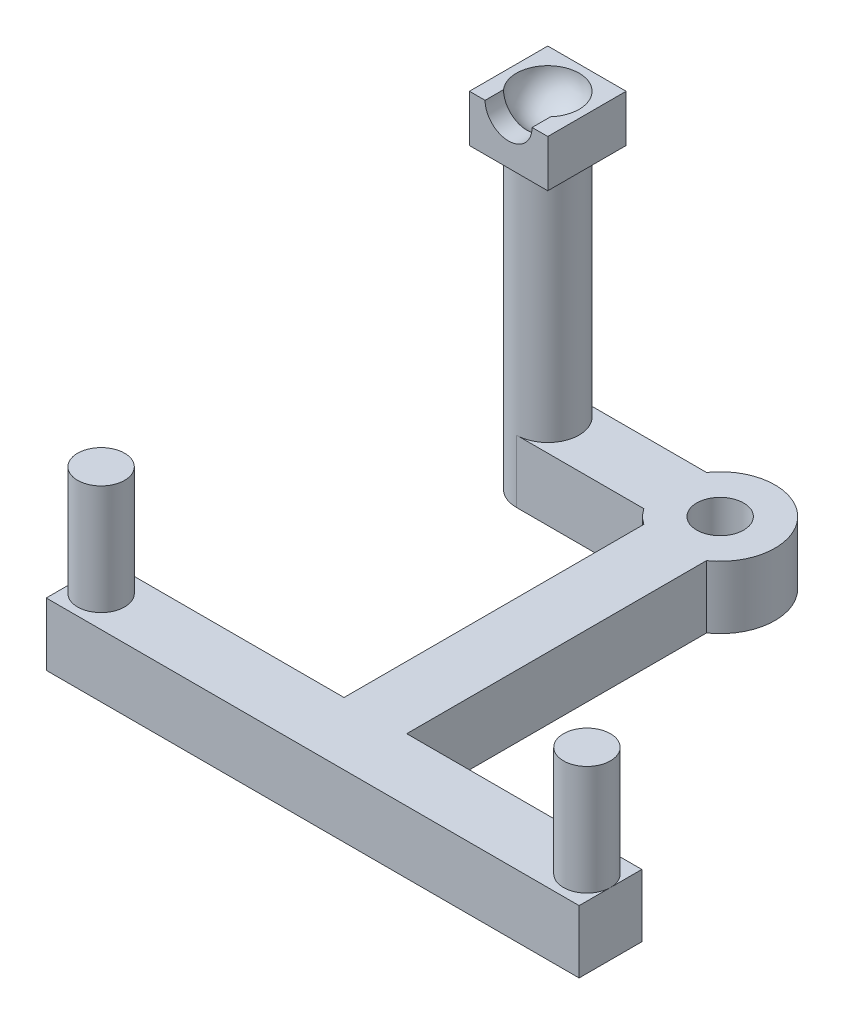
ISO-10303-21;
HEADER;
FILE_DESCRIPTION(('STEP AP214'),'2;1');
FILE_NAME('part.step','',(''),(''),'','','');
FILE_SCHEMA(('AUTOMOTIVE_DESIGN { 1 0 10303 214 1 1 1 1 }'));
ENDSEC;
DATA;
#1=APPLICATION_CONTEXT('core data for automotive mechanical design processes');
#2=APPLICATION_PROTOCOL_DEFINITION('international standard','automotive_design',2000,#1);
#3=PRODUCT_CONTEXT('',#1,'mechanical');
#4=PRODUCT('Part','Part','',(#3));
#5=PRODUCT_RELATED_PRODUCT_CATEGORY('part','',(#4));
#6=PRODUCT_DEFINITION_FORMATION('','',#4);
#7=PRODUCT_DEFINITION_CONTEXT('part definition',#1,'design');
#8=PRODUCT_DEFINITION('design','',#6,#7);
#9=PRODUCT_DEFINITION_SHAPE('','',#8);
#10=(LENGTH_UNIT() NAMED_UNIT(*) SI_UNIT(.MILLI.,.METRE.));
#11=(NAMED_UNIT(*) PLANE_ANGLE_UNIT() SI_UNIT($,.RADIAN.));
#12=(NAMED_UNIT(*) SI_UNIT($,.STERADIAN.) SOLID_ANGLE_UNIT());
#13=UNCERTAINTY_MEASURE_WITH_UNIT(LENGTH_MEASURE(1.E-05),#10,'distance_accuracy_value','');
#14=(GEOMETRIC_REPRESENTATION_CONTEXT(3) GLOBAL_UNCERTAINTY_ASSIGNED_CONTEXT((#13)) GLOBAL_UNIT_ASSIGNED_CONTEXT((#10,
#11,#12)) REPRESENTATION_CONTEXT('',''));
#15=CARTESIAN_POINT('',(0.,0.,0.));
#16=DIRECTION('',(0.,0.,1.));
#17=DIRECTION('',(1.,0.,0.));
#18=AXIS2_PLACEMENT_3D('',#15,#16,#17);
#19=CARTESIAN_POINT('',(0.,-20.,0.));
#20=DIRECTION('',(0.,1.,0.));
#21=DIRECTION('',(0.,0.,1.));
#22=AXIS2_PLACEMENT_3D('',#19,#20,#21);
#23=PLANE('',#22);
#24=CARTESIAN_POINT('',(85.,-20.,-130.));
#25=DIRECTION('',(0.,1.,0.));
#26=DIRECTION('',(0.,0.,1.));
#27=AXIS2_PLACEMENT_3D('',#24,#25,#26);
#28=CIRCLE('',#27,7.50000000000001);
#29=CARTESIAN_POINT('',(85.,-20.,-122.5));
#30=VERTEX_POINT('',#29);
#31=EDGE_CURVE('E302',#30,#30,#28,.T.);
#32=ORIENTED_EDGE('',*,*,#31,.T.);
#33=EDGE_LOOP('',(#32));
#34=FACE_BOUND('',#33,.T.);
#35=DIRECTION('',(1.,0.,0.));
#36=VECTOR('',#35,1.);
#37=CARTESIAN_POINT('',(20.,-20.,-120.));
#38=LINE('',#37,#36);
#39=CARTESIAN_POINT('',(30.,-20.,-120.));
#40=VERTEX_POINT('',#39);
#41=CARTESIAN_POINT('',(70.6385933836549,-20.,-120.));
#42=VERTEX_POINT('',#41);
#43=EDGE_CURVE('E259',#40,#42,#38,.T.);
#44=ORIENTED_EDGE('',*,*,#43,.F.);
#45=CARTESIAN_POINT('',(30.,-20.,-130.));
#46=DIRECTION('',(0.,1.,0.));
#47=DIRECTION('',(0.,0.,1.));
#48=AXIS2_PLACEMENT_3D('',#45,#46,#47);
#49=CIRCLE('',#48,9.99999999999999);
#50=CARTESIAN_POINT('',(30.,-20.,-140.));
#51=VERTEX_POINT('',#50);
#52=EDGE_CURVE('E248',#51,#40,#49,.T.);
#53=ORIENTED_EDGE('',*,*,#52,.F.);
#54=DIRECTION('',(1.,0.,0.));
#55=VECTOR('',#54,1.);
#56=CARTESIAN_POINT('',(20.,-20.,-140.));
#57=LINE('',#56,#55);
#58=CARTESIAN_POINT('',(70.6385933836549,-20.,-140.));
#59=VERTEX_POINT('',#58);
#60=EDGE_CURVE('E262',#51,#59,#57,.T.);
#61=ORIENTED_EDGE('',*,*,#60,.T.);
#62=CARTESIAN_POINT('',(85.,-20.,-130.));
#63=DIRECTION('',(0.,1.,0.));
#64=DIRECTION('',(0.,0.,1.));
#65=AXIS2_PLACEMENT_3D('',#62,#63,#64);
#66=CIRCLE('',#65,17.5);
#67=CARTESIAN_POINT('',(95.,-20.,-115.638593383655));
#68=VERTEX_POINT('',#67);
#69=EDGE_CURVE('E289',#68,#59,#66,.T.);
#70=ORIENTED_EDGE('',*,*,#69,.F.);
#71=DIRECTION('',(0.,0.,1.));
#72=VECTOR('',#71,1.);
#73=CARTESIAN_POINT('',(95.,-20.,0.));
#74=LINE('',#73,#72);
#75=CARTESIAN_POINT('',(95.,-20.,-20.));
#76=VERTEX_POINT('',#75);
#77=EDGE_CURVE('E298',#68,#76,#74,.T.);
#78=ORIENTED_EDGE('',*,*,#77,.T.);
#79=DIRECTION('',(1.,0.,0.));
#80=VECTOR('',#79,1.);
#81=CARTESIAN_POINT('',(0.,-20.,-20.));
#82=LINE('',#81,#80);
#83=CARTESIAN_POINT('',(170.,-20.,-20.));
#84=VERTEX_POINT('',#83);
#85=EDGE_CURVE('E340',#76,#84,#82,.T.);
#86=ORIENTED_EDGE('',*,*,#85,.T.);
#87=DIRECTION('',(0.,0.,-1.));
#88=VECTOR('',#87,1.);
#89=CARTESIAN_POINT('',(170.,-20.,0.));
#90=LINE('',#89,#88);
#91=CARTESIAN_POINT('',(170.,-20.,0.));
#92=VERTEX_POINT('',#91);
#93=EDGE_CURVE('E339',#92,#84,#90,.T.);
#94=ORIENTED_EDGE('',*,*,#93,.F.);
#95=DIRECTION('',(1.,0.,0.));
#96=VECTOR('',#95,1.);
#97=CARTESIAN_POINT('',(0.,-20.,0.));
#98=LINE('',#97,#96);
#99=CARTESIAN_POINT('',(0.,-20.,0.));
#100=VERTEX_POINT('',#99);
#101=EDGE_CURVE('E344',#100,#92,#98,.T.);
#102=ORIENTED_EDGE('',*,*,#101,.F.);
#103=DIRECTION('',(0.,0.,-1.));
#104=VECTOR('',#103,1.);
#105=CARTESIAN_POINT('',(0.,-20.,0.));
#106=LINE('',#105,#104);
#107=CARTESIAN_POINT('',(0.,-20.,-20.));
#108=VERTEX_POINT('',#107);
#109=EDGE_CURVE('E348',#100,#108,#106,.T.);
#110=ORIENTED_EDGE('',*,*,#109,.T.);
#111=CARTESIAN_POINT('',(75.,-20.,-20.));
#112=VERTEX_POINT('',#111);
#113=EDGE_CURVE('E335',#108,#112,#82,.T.);
#114=ORIENTED_EDGE('',*,*,#113,.T.);
#115=DIRECTION('',(0.,0.,1.));
#116=VECTOR('',#115,1.);
#117=CARTESIAN_POINT('',(75.,-20.,0.));
#118=LINE('',#117,#116);
#119=CARTESIAN_POINT('',(75.,-20.,-115.638593383655));
#120=VERTEX_POINT('',#119);
#121=EDGE_CURVE('E293',#120,#112,#118,.T.);
#122=ORIENTED_EDGE('',*,*,#121,.F.);
#123=EDGE_CURVE('E294',#42,#120,#66,.T.);
#124=ORIENTED_EDGE('',*,*,#123,.F.);
#125=EDGE_LOOP('',(#44,#53,#61,#70,#78,#86,#94,#102,#110,#114,#122,#124));
#126=FACE_BOUND('',#125,.T.);
#127=ADVANCED_FACE('F45',(#34,#126),#23,.F.);
#128=CARTESIAN_POINT('',(0.,0.,0.));
#129=DIRECTION('',(0.,1.,0.));
#130=DIRECTION('',(0.,0.,1.));
#131=AXIS2_PLACEMENT_3D('',#128,#129,#130);
#132=PLANE('',#131);
#133=CARTESIAN_POINT('',(85.,0.,-130.));
#134=DIRECTION('',(0.,1.,0.));
#135=DIRECTION('',(0.,0.,1.));
#136=AXIS2_PLACEMENT_3D('',#133,#134,#135);
#137=CIRCLE('',#136,7.50000000000001);
#138=CARTESIAN_POINT('',(85.,0.,-122.5));
#139=VERTEX_POINT('',#138);
#140=EDGE_CURVE('E320',#139,#139,#137,.T.);
#141=ORIENTED_EDGE('',*,*,#140,.F.);
#142=EDGE_LOOP('',(#141));
#143=FACE_BOUND('',#142,.T.);
#144=DIRECTION('',(1.,0.,0.));
#145=VECTOR('',#144,1.);
#146=CARTESIAN_POINT('',(20.,0.,-140.));
#147=LINE('',#146,#145);
#148=CARTESIAN_POINT('',(30.,0.,-140.));
#149=VERTEX_POINT('',#148);
#150=CARTESIAN_POINT('',(70.6385933836549,0.,-140.));
#151=VERTEX_POINT('',#150);
#152=EDGE_CURVE('E254',#149,#151,#147,.T.);
#153=ORIENTED_EDGE('',*,*,#152,.F.);
#154=CARTESIAN_POINT('',(30.,0.,-130.));
#155=DIRECTION('',(0.,1.,0.));
#156=DIRECTION('',(0.,0.,1.));
#157=AXIS2_PLACEMENT_3D('',#154,#155,#156);
#158=CIRCLE('',#157,10.);
#159=CARTESIAN_POINT('',(30.,0.,-120.));
#160=VERTEX_POINT('',#159);
#161=EDGE_CURVE('E236',#160,#149,#158,.T.);
#162=ORIENTED_EDGE('',*,*,#161,.F.);
#163=DIRECTION('',(1.,0.,0.));
#164=VECTOR('',#163,1.);
#165=CARTESIAN_POINT('',(20.,0.,-120.));
#166=LINE('',#165,#164);
#167=CARTESIAN_POINT('',(70.6385933836549,0.,-120.));
#168=VERTEX_POINT('',#167);
#169=EDGE_CURVE('E68',#160,#168,#166,.T.);
#170=ORIENTED_EDGE('',*,*,#169,.T.);
#171=CARTESIAN_POINT('',(85.,0.,-130.));
#172=DIRECTION('',(0.,1.,0.));
#173=DIRECTION('',(0.,0.,1.));
#174=AXIS2_PLACEMENT_3D('',#171,#172,#173);
#175=CIRCLE('',#174,17.5);
#176=CARTESIAN_POINT('',(75.,0.,-115.638593383655));
#177=VERTEX_POINT('',#176);
#178=EDGE_CURVE('E312',#168,#177,#175,.T.);
#179=ORIENTED_EDGE('',*,*,#178,.T.);
#180=DIRECTION('',(0.,0.,1.));
#181=VECTOR('',#180,1.);
#182=CARTESIAN_POINT('',(75.,0.,0.));
#183=LINE('',#182,#181);
#184=CARTESIAN_POINT('',(75.,0.,-20.));
#185=VERTEX_POINT('',#184);
#186=EDGE_CURVE('E311',#177,#185,#183,.T.);
#187=ORIENTED_EDGE('',*,*,#186,.T.);
#188=DIRECTION('',(1.,0.,0.));
#189=VECTOR('',#188,1.);
#190=CARTESIAN_POINT('',(0.,0.,-20.));
#191=LINE('',#190,#189);
#192=CARTESIAN_POINT('',(0.,0.,-20.));
#193=VERTEX_POINT('',#192);
#194=EDGE_CURVE('E352',#193,#185,#191,.T.);
#195=ORIENTED_EDGE('',*,*,#194,.F.);
#196=DIRECTION('',(0.,0.,-1.));
#197=VECTOR('',#196,1.);
#198=CARTESIAN_POINT('',(0.,0.,0.));
#199=LINE('',#198,#197);
#200=CARTESIAN_POINT('',(0.,0.,-10.));
#201=VERTEX_POINT('',#200);
#202=EDGE_CURVE('E365',#201,#193,#199,.T.);
#203=ORIENTED_EDGE('',*,*,#202,.F.);
#204=CARTESIAN_POINT('',(7.5,0.,-10.));
#205=DIRECTION('',(0.,1.,0.));
#206=DIRECTION('',(0.,0.,1.));
#207=AXIS2_PLACEMENT_3D('',#204,#205,#206);
#208=CIRCLE('',#207,7.5);
#209=EDGE_CURVE('E277',#201,#201,#208,.T.);
#210=ORIENTED_EDGE('',*,*,#209,.F.);
#211=CARTESIAN_POINT('',(0.,0.,0.));
#212=VERTEX_POINT('',#211);
#213=EDGE_CURVE('E366',#212,#201,#199,.T.);
#214=ORIENTED_EDGE('',*,*,#213,.F.);
#215=DIRECTION('',(1.,0.,0.));
#216=VECTOR('',#215,1.);
#217=CARTESIAN_POINT('',(0.,0.,0.));
#218=LINE('',#217,#216);
#219=CARTESIAN_POINT('',(170.,0.,0.));
#220=VERTEX_POINT('',#219);
#221=EDGE_CURVE('E361',#212,#220,#218,.T.);
#222=ORIENTED_EDGE('',*,*,#221,.T.);
#223=DIRECTION('',(0.,0.,-1.));
#224=VECTOR('',#223,1.);
#225=CARTESIAN_POINT('',(170.,0.,0.));
#226=LINE('',#225,#224);
#227=CARTESIAN_POINT('',(170.,0.,-10.));
#228=VERTEX_POINT('',#227);
#229=EDGE_CURVE('E357',#220,#228,#226,.T.);
#230=ORIENTED_EDGE('',*,*,#229,.T.);
#231=CARTESIAN_POINT('',(162.5,0.,-10.));
#232=DIRECTION('',(0.,1.,0.));
#233=DIRECTION('',(0.,0.,1.));
#234=AXIS2_PLACEMENT_3D('',#231,#232,#233);
#235=CIRCLE('',#234,7.50000000000001);
#236=EDGE_CURVE('E274',#228,#228,#235,.T.);
#237=ORIENTED_EDGE('',*,*,#236,.F.);
#238=CARTESIAN_POINT('',(170.,0.,-20.));
#239=VERTEX_POINT('',#238);
#240=EDGE_CURVE('E356',#228,#239,#226,.T.);
#241=ORIENTED_EDGE('',*,*,#240,.T.);
#242=CARTESIAN_POINT('',(95.,0.,-20.));
#243=VERTEX_POINT('',#242);
#244=EDGE_CURVE('E285',#243,#239,#191,.T.);
#245=ORIENTED_EDGE('',*,*,#244,.F.);
#246=DIRECTION('',(0.,0.,1.));
#247=VECTOR('',#246,1.);
#248=CARTESIAN_POINT('',(95.,0.,0.));
#249=LINE('',#248,#247);
#250=CARTESIAN_POINT('',(95.,0.,-115.638593383655));
#251=VERTEX_POINT('',#250);
#252=EDGE_CURVE('E316',#251,#243,#249,.T.);
#253=ORIENTED_EDGE('',*,*,#252,.F.);
#254=EDGE_CURVE('E307',#251,#151,#175,.T.);
#255=ORIENTED_EDGE('',*,*,#254,.T.);
#256=EDGE_LOOP('',(#153,#162,#170,#179,#187,#195,#203,#210,#214,#222,#230,#237,#241,#245,#253,#255));
#257=FACE_BOUND('',#256,.T.);
#258=ADVANCED_FACE('F411',(#143,#257),#132,.T.);
#259=CARTESIAN_POINT('',(20.,0.,-120.));
#260=DIRECTION('',(0.,0.,-1.));
#261=DIRECTION('',(-1.,0.,0.));
#262=AXIS2_PLACEMENT_3D('',#259,#260,#261);
#263=PLANE('',#262);
#264=DIRECTION('',(0.,1.,0.));
#265=VECTOR('',#264,1.);
#266=CARTESIAN_POINT('',(30.,-20.,-120.));
#267=LINE('',#266,#265);
#268=EDGE_CURVE('E241',#40,#160,#267,.T.);
#269=ORIENTED_EDGE('',*,*,#268,.F.);
#270=ORIENTED_EDGE('',*,*,#43,.T.);
#271=DIRECTION('',(0.,1.,0.));
#272=VECTOR('',#271,1.);
#273=CARTESIAN_POINT('',(70.6385933836549,-20.,-120.));
#274=LINE('',#273,#272);
#275=EDGE_CURVE('E265',#168,#42,#274,.F.);
#276=ORIENTED_EDGE('',*,*,#275,.F.);
#277=ORIENTED_EDGE('',*,*,#169,.F.);
#278=EDGE_LOOP('',(#269,#270,#276,#277));
#279=FACE_BOUND('',#278,.T.);
#280=ADVANCED_FACE('F417',(#279),#263,.F.);
#281=CARTESIAN_POINT('',(85.,-20.,-130.));
#282=DIRECTION('',(0.,1.,0.));
#283=DIRECTION('',(0.,0.,1.));
#284=AXIS2_PLACEMENT_3D('',#281,#282,#283);
#285=CYLINDRICAL_SURFACE('',#284,17.5);
#286=ORIENTED_EDGE('',*,*,#69,.T.);
#287=DIRECTION('',(0.,1.,0.));
#288=VECTOR('',#287,1.);
#289=CARTESIAN_POINT('',(70.6385933836549,-20.,-140.));
#290=LINE('',#289,#288);
#291=EDGE_CURVE('E269',#59,#151,#290,.T.);
#292=ORIENTED_EDGE('',*,*,#291,.T.);
#293=ORIENTED_EDGE('',*,*,#254,.F.);
#294=DIRECTION('',(0.,1.,0.));
#295=VECTOR('',#294,1.);
#296=CARTESIAN_POINT('',(95.,-20.,-115.638593383655));
#297=LINE('',#296,#295);
#298=EDGE_CURVE('E54',#68,#251,#297,.T.);
#299=ORIENTED_EDGE('',*,*,#298,.F.);
#300=EDGE_LOOP('',(#286,#292,#293,#299));
#301=FACE_BOUND('',#300,.T.);
#302=ADVANCED_FACE('F440',(#301),#285,.T.);
#303=ORIENTED_EDGE('',*,*,#178,.F.);
#304=ORIENTED_EDGE('',*,*,#275,.T.);
#305=ORIENTED_EDGE('',*,*,#123,.T.);
#306=DIRECTION('',(0.,1.,0.));
#307=VECTOR('',#306,1.);
#308=CARTESIAN_POINT('',(75.,-20.,-115.638593383655));
#309=LINE('',#308,#307);
#310=EDGE_CURVE('E306',#120,#177,#309,.T.);
#311=ORIENTED_EDGE('',*,*,#310,.T.);
#312=EDGE_LOOP('',(#303,#304,#305,#311));
#313=FACE_BOUND('',#312,.T.);
#314=ADVANCED_FACE('F434',(#313),#285,.T.);
#315=CARTESIAN_POINT('',(95.,-20.,0.));
#316=DIRECTION('',(-1.,0.,0.));
#317=DIRECTION('',(0.,0.,1.));
#318=AXIS2_PLACEMENT_3D('',#315,#316,#317);
#319=PLANE('',#318);
#320=ORIENTED_EDGE('',*,*,#252,.T.);
#321=DIRECTION('',(0.,1.,0.));
#322=VECTOR('',#321,1.);
#323=CARTESIAN_POINT('',(95.,-20.,-20.));
#324=LINE('',#323,#322);
#325=EDGE_CURVE('E326',#76,#243,#324,.T.);
#326=ORIENTED_EDGE('',*,*,#325,.F.);
#327=ORIENTED_EDGE('',*,*,#77,.F.);
#328=ORIENTED_EDGE('',*,*,#298,.T.);
#329=EDGE_LOOP('',(#320,#326,#327,#328));
#330=FACE_BOUND('',#329,.T.);
#331=ADVANCED_FACE('F431',(#330),#319,.F.);
#332=CARTESIAN_POINT('',(75.,-20.,0.));
#333=DIRECTION('',(-1.,0.,0.));
#334=DIRECTION('',(0.,0.,1.));
#335=AXIS2_PLACEMENT_3D('',#332,#333,#334);
#336=PLANE('',#335);
#337=ORIENTED_EDGE('',*,*,#186,.F.);
#338=ORIENTED_EDGE('',*,*,#310,.F.);
#339=ORIENTED_EDGE('',*,*,#121,.T.);
#340=DIRECTION('',(0.,1.,0.));
#341=VECTOR('',#340,1.);
#342=CARTESIAN_POINT('',(75.,-20.,-20.));
#343=LINE('',#342,#341);
#344=EDGE_CURVE('E329',#112,#185,#343,.T.);
#345=ORIENTED_EDGE('',*,*,#344,.T.);
#346=EDGE_LOOP('',(#337,#338,#339,#345));
#347=FACE_BOUND('',#346,.T.);
#348=ADVANCED_FACE('F429',(#347),#336,.T.);
#349=CARTESIAN_POINT('',(85.,-20.,-130.));
#350=DIRECTION('',(0.,1.,0.));
#351=DIRECTION('',(0.,0.,1.));
#352=AXIS2_PLACEMENT_3D('',#349,#350,#351);
#353=CYLINDRICAL_SURFACE('',#352,7.50000000000001);
#354=ORIENTED_EDGE('',*,*,#31,.F.);
#355=EDGE_LOOP('',(#354));
#356=FACE_BOUND('',#355,.T.);
#357=ORIENTED_EDGE('',*,*,#140,.T.);
#358=EDGE_LOOP('',(#357));
#359=FACE_BOUND('',#358,.T.);
#360=ADVANCED_FACE('F425',(#356,#359),#353,.F.);
#361=CARTESIAN_POINT('',(0.,-20.,0.));
#362=DIRECTION('',(0.,0.,1.));
#363=DIRECTION('',(1.,0.,0.));
#364=AXIS2_PLACEMENT_3D('',#361,#362,#363);
#365=PLANE('',#364);
#366=ORIENTED_EDGE('',*,*,#221,.F.);
#367=DIRECTION('',(0.,1.,0.));
#368=VECTOR('',#367,1.);
#369=CARTESIAN_POINT('',(0.,-20.,0.));
#370=LINE('',#369,#368);
#371=EDGE_CURVE('E372',#100,#212,#370,.T.);
#372=ORIENTED_EDGE('',*,*,#371,.F.);
#373=ORIENTED_EDGE('',*,*,#101,.T.);
#374=DIRECTION('',(0.,1.,0.));
#375=VECTOR('',#374,1.);
#376=CARTESIAN_POINT('',(170.,-20.,0.));
#377=LINE('',#376,#375);
#378=EDGE_CURVE('E375',#92,#220,#377,.T.);
#379=ORIENTED_EDGE('',*,*,#378,.T.);
#380=EDGE_LOOP('',(#366,#372,#373,#379));
#381=FACE_BOUND('',#380,.T.);
#382=ADVANCED_FACE('F428',(#381),#365,.T.);
#383=CARTESIAN_POINT('',(0.,-20.,0.));
#384=DIRECTION('',(1.,0.,0.));
#385=DIRECTION('',(0.,0.,-1.));
#386=AXIS2_PLACEMENT_3D('',#383,#384,#385);
#387=PLANE('',#386);
#388=ORIENTED_EDGE('',*,*,#213,.T.);
#389=ORIENTED_EDGE('',*,*,#202,.T.);
#390=DIRECTION('',(0.,1.,0.));
#391=VECTOR('',#390,1.);
#392=CARTESIAN_POINT('',(0.,-20.,-20.));
#393=LINE('',#392,#391);
#394=EDGE_CURVE('E351',#108,#193,#393,.T.);
#395=ORIENTED_EDGE('',*,*,#394,.F.);
#396=ORIENTED_EDGE('',*,*,#109,.F.);
#397=ORIENTED_EDGE('',*,*,#371,.T.);
#398=EDGE_LOOP('',(#388,#389,#395,#396,#397));
#399=FACE_BOUND('',#398,.T.);
#400=ADVANCED_FACE('F436',(#399),#387,.F.);
#401=CARTESIAN_POINT('',(170.,-20.,0.));
#402=DIRECTION('',(1.,0.,0.));
#403=DIRECTION('',(0.,0.,-1.));
#404=AXIS2_PLACEMENT_3D('',#401,#402,#403);
#405=PLANE('',#404);
#406=ORIENTED_EDGE('',*,*,#229,.F.);
#407=ORIENTED_EDGE('',*,*,#378,.F.);
#408=ORIENTED_EDGE('',*,*,#93,.T.);
#409=DIRECTION('',(0.,1.,0.));
#410=VECTOR('',#409,1.);
#411=CARTESIAN_POINT('',(170.,-20.,-20.));
#412=LINE('',#411,#410);
#413=EDGE_CURVE('E378',#84,#239,#412,.T.);
#414=ORIENTED_EDGE('',*,*,#413,.T.);
#415=ORIENTED_EDGE('',*,*,#240,.F.);
#416=EDGE_LOOP('',(#406,#407,#408,#414,#415));
#417=FACE_BOUND('',#416,.T.);
#418=ADVANCED_FACE('F446',(#417),#405,.T.);
#419=CARTESIAN_POINT('',(0.,-20.,-20.));
#420=DIRECTION('',(0.,0.,1.));
#421=DIRECTION('',(1.,0.,0.));
#422=AXIS2_PLACEMENT_3D('',#419,#420,#421);
#423=PLANE('',#422);
#424=ORIENTED_EDGE('',*,*,#85,.F.);
#425=ORIENTED_EDGE('',*,*,#325,.T.);
#426=ORIENTED_EDGE('',*,*,#244,.T.);
#427=ORIENTED_EDGE('',*,*,#413,.F.);
#428=EDGE_LOOP('',(#424,#425,#426,#427));
#429=FACE_BOUND('',#428,.T.);
#430=ADVANCED_FACE('F451',(#429),#423,.F.);
#431=ORIENTED_EDGE('',*,*,#344,.F.);
#432=ORIENTED_EDGE('',*,*,#113,.F.);
#433=ORIENTED_EDGE('',*,*,#394,.T.);
#434=ORIENTED_EDGE('',*,*,#194,.T.);
#435=EDGE_LOOP('',(#431,#432,#433,#434));
#436=FACE_BOUND('',#435,.T.);
#437=ADVANCED_FACE('F47',(#436),#423,.F.);
#438=CARTESIAN_POINT('',(7.5,35.,-10.));
#439=DIRECTION('',(0.,-1.,0.));
#440=DIRECTION('',(0.,0.,-1.));
#441=AXIS2_PLACEMENT_3D('',#438,#439,#440);
#442=CYLINDRICAL_SURFACE('',#441,7.5);
#443=CARTESIAN_POINT('',(7.5,35.,-10.));
#444=DIRECTION('',(0.,1.,0.));
#445=DIRECTION('',(0.,0.,1.));
#446=AXIS2_PLACEMENT_3D('',#443,#444,#445);
#447=CIRCLE('',#446,7.5);
#448=CARTESIAN_POINT('',(7.5,35.,-2.5));
#449=VERTEX_POINT('',#448);
#450=EDGE_CURVE('E281',#449,#449,#447,.T.);
#451=ORIENTED_EDGE('',*,*,#450,.F.);
#452=EDGE_LOOP('',(#451));
#453=FACE_BOUND('',#452,.T.);
#454=ORIENTED_EDGE('',*,*,#209,.T.);
#455=EDGE_LOOP('',(#454));
#456=FACE_BOUND('',#455,.T.);
#457=ADVANCED_FACE('F422',(#453,#456),#442,.T.);
#458=CARTESIAN_POINT('',(7.5,35.,-10.));
#459=DIRECTION('',(0.,1.,0.));
#460=DIRECTION('',(0.,0.,1.));
#461=AXIS2_PLACEMENT_3D('',#458,#459,#460);
#462=PLANE('',#461);
#463=ORIENTED_EDGE('',*,*,#450,.T.);
#464=EDGE_LOOP('',(#463));
#465=FACE_BOUND('',#464,.T.);
#466=ADVANCED_FACE('F463',(#465),#462,.T.);
#467=CARTESIAN_POINT('',(162.5,35.,-10.));
#468=DIRECTION('',(0.,-1.,0.));
#469=DIRECTION('',(0.,0.,-1.));
#470=AXIS2_PLACEMENT_3D('',#467,#468,#469);
#471=CYLINDRICAL_SURFACE('',#470,7.50000000000001);
#472=CARTESIAN_POINT('',(162.5,35.,-10.));
#473=DIRECTION('',(0.,1.,0.));
#474=DIRECTION('',(0.,0.,1.));
#475=AXIS2_PLACEMENT_3D('',#472,#473,#474);
#476=CIRCLE('',#475,7.50000000000001);
#477=CARTESIAN_POINT('',(162.5,35.,-2.49999999999999));
#478=VERTEX_POINT('',#477);
#479=EDGE_CURVE('E273',#478,#478,#476,.T.);
#480=ORIENTED_EDGE('',*,*,#479,.F.);
#481=EDGE_LOOP('',(#480));
#482=FACE_BOUND('',#481,.T.);
#483=ORIENTED_EDGE('',*,*,#236,.T.);
#484=EDGE_LOOP('',(#483));
#485=FACE_BOUND('',#484,.T.);
#486=ADVANCED_FACE('F498',(#482,#485),#471,.T.);
#487=CARTESIAN_POINT('',(162.5,35.,-10.));
#488=DIRECTION('',(0.,1.,0.));
#489=DIRECTION('',(0.,0.,1.));
#490=AXIS2_PLACEMENT_3D('',#487,#488,#489);
#491=PLANE('',#490);
#492=ORIENTED_EDGE('',*,*,#479,.T.);
#493=EDGE_LOOP('',(#492));
#494=FACE_BOUND('',#493,.T.);
#495=ADVANCED_FACE('F500',(#494),#491,.T.);
#496=CARTESIAN_POINT('',(20.,0.,-140.));
#497=DIRECTION('',(0.,0.,1.));
#498=DIRECTION('',(1.,0.,0.));
#499=AXIS2_PLACEMENT_3D('',#496,#497,#498);
#500=PLANE('',#499);
#501=ORIENTED_EDGE('',*,*,#60,.F.);
#502=DIRECTION('',(0.,1.,0.));
#503=VECTOR('',#502,1.);
#504=CARTESIAN_POINT('',(30.,-20.,-140.));
#505=LINE('',#504,#503);
#506=EDGE_CURVE('E251',#51,#149,#505,.T.);
#507=ORIENTED_EDGE('',*,*,#506,.T.);
#508=ORIENTED_EDGE('',*,*,#152,.T.);
#509=ORIENTED_EDGE('',*,*,#291,.F.);
#510=EDGE_LOOP('',(#501,#507,#508,#509));
#511=FACE_BOUND('',#510,.T.);
#512=ADVANCED_FACE('F507',(#511),#500,.F.);
#513=CARTESIAN_POINT('',(30.,-20.,-130.));
#514=DIRECTION('',(0.,1.,0.));
#515=DIRECTION('',(0.,0.,1.));
#516=AXIS2_PLACEMENT_3D('',#513,#514,#515);
#517=CYLINDRICAL_SURFACE('',#516,9.99999999999999);
#518=ORIENTED_EDGE('',*,*,#268,.T.);
#519=ORIENTED_EDGE('',*,*,#161,.T.);
#520=ORIENTED_EDGE('',*,*,#506,.F.);
#521=ORIENTED_EDGE('',*,*,#52,.T.);
#522=EDGE_LOOP('',(#518,#519,#520,#521));
#523=FACE_BOUND('',#522,.T.);
#524=CARTESIAN_POINT('',(30.,75.,-130.));
#525=DIRECTION('',(0.,1.,0.));
#526=DIRECTION('',(0.,0.,1.));
#527=AXIS2_PLACEMENT_3D('',#524,#525,#526);
#528=CIRCLE('',#527,10.);
#529=CARTESIAN_POINT('',(30.,75.,-120.));
#530=VERTEX_POINT('',#529);
#531=EDGE_CURVE('E237',#530,#530,#528,.T.);
#532=ORIENTED_EDGE('',*,*,#531,.F.);
#533=EDGE_LOOP('',(#532));
#534=FACE_BOUND('',#533,.T.);
#535=ADVANCED_FACE('F515',(#523,#534),#517,.T.);
#536=CARTESIAN_POINT('',(42.5,90.,-142.5));
#537=DIRECTION('',(-1.,0.,0.));
#538=DIRECTION('',(0.,0.,1.));
#539=AXIS2_PLACEMENT_3D('',#536,#537,#538);
#540=PLANE('',#539);
#541=DIRECTION('',(0.,0.,-1.));
#542=VECTOR('',#541,1.);
#543=CARTESIAN_POINT('',(42.5,75.,-142.5));
#544=LINE('',#543,#542);
#545=CARTESIAN_POINT('',(42.5,75.,-117.5));
#546=VERTEX_POINT('',#545);
#547=CARTESIAN_POINT('',(42.5,75.,-142.5));
#548=VERTEX_POINT('',#547);
#549=EDGE_CURVE('E208',#546,#548,#544,.T.);
#550=ORIENTED_EDGE('',*,*,#549,.T.);
#551=DIRECTION('',(0.,-1.,0.));
#552=VECTOR('',#551,1.);
#553=CARTESIAN_POINT('',(42.5,90.,-142.5));
#554=LINE('',#553,#552);
#555=CARTESIAN_POINT('',(42.5,90.,-142.5));
#556=VERTEX_POINT('',#555);
#557=EDGE_CURVE('E232',#556,#548,#554,.T.);
#558=ORIENTED_EDGE('',*,*,#557,.F.);
#559=DIRECTION('',(0.,0.,-1.));
#560=VECTOR('',#559,1.);
#561=CARTESIAN_POINT('',(42.5,90.,-142.5));
#562=LINE('',#561,#560);
#563=CARTESIAN_POINT('',(42.5,90.,-117.5));
#564=VERTEX_POINT('',#563);
#565=EDGE_CURVE('E221',#564,#556,#562,.T.);
#566=ORIENTED_EDGE('',*,*,#565,.F.);
#567=DIRECTION('',(0.,-1.,0.));
#568=VECTOR('',#567,1.);
#569=CARTESIAN_POINT('',(42.5,90.,-117.5));
#570=LINE('',#569,#568);
#571=EDGE_CURVE('E196',#564,#546,#570,.T.);
#572=ORIENTED_EDGE('',*,*,#571,.T.);
#573=EDGE_LOOP('',(#550,#558,#566,#572));
#574=FACE_BOUND('',#573,.T.);
#575=ADVANCED_FACE('F522',(#574),#540,.F.);
#576=CARTESIAN_POINT('',(17.5,90.,-142.5));
#577=DIRECTION('',(0.,0.,1.));
#578=DIRECTION('',(1.,0.,0.));
#579=AXIS2_PLACEMENT_3D('',#576,#577,#578);
#580=PLANE('',#579);
#581=DIRECTION('',(-1.,0.,0.));
#582=VECTOR('',#581,1.);
#583=CARTESIAN_POINT('',(17.5,75.,-142.5));
#584=LINE('',#583,#582);
#585=CARTESIAN_POINT('',(17.5,75.,-142.5));
#586=VERTEX_POINT('',#585);
#587=EDGE_CURVE('E212',#548,#586,#584,.T.);
#588=ORIENTED_EDGE('',*,*,#587,.T.);
#589=DIRECTION('',(0.,-1.,0.));
#590=VECTOR('',#589,1.);
#591=CARTESIAN_POINT('',(17.5,90.,-142.5));
#592=LINE('',#591,#590);
#593=CARTESIAN_POINT('',(17.5,90.,-142.5));
#594=VERTEX_POINT('',#593);
#595=EDGE_CURVE('E228',#594,#586,#592,.T.);
#596=ORIENTED_EDGE('',*,*,#595,.F.);
#597=DIRECTION('',(-1.,0.,0.));
#598=VECTOR('',#597,1.);
#599=CARTESIAN_POINT('',(17.5,90.,-142.5));
#600=LINE('',#599,#598);
#601=EDGE_CURVE('E204',#556,#594,#600,.T.);
#602=ORIENTED_EDGE('',*,*,#601,.F.);
#603=ORIENTED_EDGE('',*,*,#557,.T.);
#604=EDGE_LOOP('',(#588,#596,#602,#603));
#605=FACE_BOUND('',#604,.T.);
#606=ADVANCED_FACE('F392',(#605),#580,.F.);
#607=CARTESIAN_POINT('',(17.5,90.,-142.5));
#608=DIRECTION('',(1.,0.,0.));
#609=DIRECTION('',(0.,0.,-1.));
#610=AXIS2_PLACEMENT_3D('',#607,#608,#609);
#611=PLANE('',#610);
#612=DIRECTION('',(0.,0.,1.));
#613=VECTOR('',#612,1.);
#614=CARTESIAN_POINT('',(17.5,75.,-142.5));
#615=LINE('',#614,#613);
#616=CARTESIAN_POINT('',(17.5,75.,-117.5));
#617=VERTEX_POINT('',#616);
#618=EDGE_CURVE('E215',#586,#617,#615,.T.);
#619=ORIENTED_EDGE('',*,*,#618,.T.);
#620=DIRECTION('',(0.,-1.,0.));
#621=VECTOR('',#620,1.);
#622=CARTESIAN_POINT('',(17.5,90.,-117.5));
#623=LINE('',#622,#621);
#624=CARTESIAN_POINT('',(17.5,90.,-117.5));
#625=VERTEX_POINT('',#624);
#626=EDGE_CURVE('E224',#625,#617,#623,.T.);
#627=ORIENTED_EDGE('',*,*,#626,.F.);
#628=DIRECTION('',(0.,0.,1.));
#629=VECTOR('',#628,1.);
#630=CARTESIAN_POINT('',(17.5,90.,-142.5));
#631=LINE('',#630,#629);
#632=EDGE_CURVE('E200',#594,#625,#631,.T.);
#633=ORIENTED_EDGE('',*,*,#632,.F.);
#634=ORIENTED_EDGE('',*,*,#595,.T.);
#635=EDGE_LOOP('',(#619,#627,#633,#634));
#636=FACE_BOUND('',#635,.T.);
#637=ADVANCED_FACE('F395',(#636),#611,.F.);
#638=CARTESIAN_POINT('',(17.5,90.,-117.5));
#639=DIRECTION('',(0.,0.,-1.));
#640=DIRECTION('',(-1.,0.,0.));
#641=AXIS2_PLACEMENT_3D('',#638,#639,#640);
#642=PLANE('',#641);
#643=DIRECTION('',(1.,0.,0.));
#644=VECTOR('',#643,1.);
#645=CARTESIAN_POINT('',(17.5,90.,-117.5));
#646=LINE('',#645,#644);
#647=CARTESIAN_POINT('',(37.5,90.,-117.5));
#648=VERTEX_POINT('',#647);
#649=EDGE_CURVE('E188',#648,#564,#646,.T.);
#650=ORIENTED_EDGE('',*,*,#649,.F.);
#651=CARTESIAN_POINT('',(30.,90.,-117.5));
#652=DIRECTION('',(0.,0.,1.));
#653=DIRECTION('',(1.,0.,0.));
#654=AXIS2_PLACEMENT_3D('',#651,#652,#653);
#655=CIRCLE('',#654,7.50000000000001);
#656=CARTESIAN_POINT('',(22.5,90.,-117.5));
#657=VERTEX_POINT('',#656);
#658=EDGE_CURVE('E174',#657,#648,#655,.T.);
#659=ORIENTED_EDGE('',*,*,#658,.F.);
#660=EDGE_CURVE('E199',#625,#657,#646,.T.);
#661=ORIENTED_EDGE('',*,*,#660,.F.);
#662=ORIENTED_EDGE('',*,*,#626,.T.);
#663=DIRECTION('',(1.,0.,0.));
#664=VECTOR('',#663,1.);
#665=CARTESIAN_POINT('',(17.5,75.,-117.5));
#666=LINE('',#665,#664);
#667=EDGE_CURVE('E218',#617,#546,#666,.T.);
#668=ORIENTED_EDGE('',*,*,#667,.T.);
#669=ORIENTED_EDGE('',*,*,#571,.F.);
#670=EDGE_LOOP('',(#650,#659,#661,#662,#668,#669));
#671=FACE_BOUND('',#670,.T.);
#672=ADVANCED_FACE('F194',(#671),#642,.F.);
#673=CARTESIAN_POINT('',(0.,90.,0.));
#674=DIRECTION('',(0.,1.,0.));
#675=DIRECTION('',(0.,0.,1.));
#676=AXIS2_PLACEMENT_3D('',#673,#674,#675);
#677=PLANE('',#676);
#678=DIRECTION('',(0.,0.,1.));
#679=VECTOR('',#678,1.);
#680=CARTESIAN_POINT('',(22.5,90.,-125.5));
#681=LINE('',#680,#679);
#682=CARTESIAN_POINT('',(22.5,90.,-123.385621722339));
#683=VERTEX_POINT('',#682);
#684=EDGE_CURVE('E177',#683,#657,#681,.T.);
#685=ORIENTED_EDGE('',*,*,#684,.F.);
#686=CARTESIAN_POINT('',(30.,90.,-130.));
#687=DIRECTION('',(0.,1.,0.));
#688=DIRECTION('',(0.,0.,1.));
#689=AXIS2_PLACEMENT_3D('',#686,#687,#688);
#690=CIRCLE('',#689,10.);
#691=CARTESIAN_POINT('',(37.5,90.,-123.385621722339));
#692=VERTEX_POINT('',#691);
#693=EDGE_CURVE('E191',#683,#692,#690,.F.);
#694=ORIENTED_EDGE('',*,*,#693,.T.);
#695=DIRECTION('',(0.,0.,1.));
#696=VECTOR('',#695,1.);
#697=CARTESIAN_POINT('',(37.5,90.,-125.5));
#698=LINE('',#697,#696);
#699=EDGE_CURVE('E60',#648,#692,#698,.F.);
#700=ORIENTED_EDGE('',*,*,#699,.F.);
#701=ORIENTED_EDGE('',*,*,#649,.T.);
#702=ORIENTED_EDGE('',*,*,#565,.T.);
#703=ORIENTED_EDGE('',*,*,#601,.T.);
#704=ORIENTED_EDGE('',*,*,#632,.T.);
#705=ORIENTED_EDGE('',*,*,#660,.T.);
#706=EDGE_LOOP('',(#685,#694,#700,#701,#702,#703,#704,#705));
#707=FACE_BOUND('',#706,.T.);
#708=ADVANCED_FACE('F186',(#707),#677,.T.);
#709=CARTESIAN_POINT('',(0.,75.,0.));
#710=DIRECTION('',(0.,1.,0.));
#711=DIRECTION('',(0.,0.,1.));
#712=AXIS2_PLACEMENT_3D('',#709,#710,#711);
#713=PLANE('',#712);
#714=ORIENTED_EDGE('',*,*,#531,.T.);
#715=EDGE_LOOP('',(#714));
#716=FACE_BOUND('',#715,.T.);
#717=ORIENTED_EDGE('',*,*,#549,.F.);
#718=ORIENTED_EDGE('',*,*,#667,.F.);
#719=ORIENTED_EDGE('',*,*,#618,.F.);
#720=ORIENTED_EDGE('',*,*,#587,.F.);
#721=EDGE_LOOP('',(#717,#718,#719,#720));
#722=FACE_BOUND('',#721,.T.);
#723=ADVANCED_FACE('F400',(#716,#722),#713,.F.);
#724=CARTESIAN_POINT('',(30.,90.,-130.));
#725=DIRECTION('',(0.,0.,-1.));
#726=DIRECTION('',(1.,0.,0.));
#727=AXIS2_PLACEMENT_3D('',#724,#725,#726);
#728=SPHERICAL_SURFACE('',#727,10.);
#729=CARTESIAN_POINT('',(30.,90.,-123.385621722339));
#730=DIRECTION('',(0.,0.,-0.999999999999999));
#731=DIRECTION('',(-1.,0.,0.));
#732=AXIS2_PLACEMENT_3D('',#729,#730,#731);
#733=CIRCLE('',#732,7.50000000000001);
#734=EDGE_CURVE('E11',#692,#683,#733,.T.);
#735=ORIENTED_EDGE('',*,*,#734,.F.);
#736=ORIENTED_EDGE('',*,*,#693,.F.);
#737=EDGE_LOOP('',(#735,#736));
#738=FACE_BOUND('',#737,.T.);
#739=ADVANCED_FACE('F398',(#738),#728,.F.);
#740=CARTESIAN_POINT('',(30.,90.,-125.5));
#741=DIRECTION('',(0.,0.,1.));
#742=DIRECTION('',(1.,0.,0.));
#743=AXIS2_PLACEMENT_3D('',#740,#741,#742);
#744=CYLINDRICAL_SURFACE('',#743,7.50000000000001);
#745=ORIENTED_EDGE('',*,*,#684,.T.);
#746=ORIENTED_EDGE('',*,*,#658,.T.);
#747=ORIENTED_EDGE('',*,*,#699,.T.);
#748=ORIENTED_EDGE('',*,*,#734,.T.);
#749=EDGE_LOOP('',(#745,#746,#747,#748));
#750=FACE_BOUND('',#749,.T.);
#751=ADVANCED_FACE('F175',(#750),#744,.F.);
#752=CLOSED_SHELL('',(#127,#258,#280,#302,#314,#331,#348,#360,#382,#400,#418,#430,#437,#457,
#466,#486,#495,#512,#535,#575,#606,#637,#672,#708,#723,#739,#751));
#753=MANIFOLD_SOLID_BREP('B2',#752);
#754=ADVANCED_BREP_SHAPE_REPRESENTATION('',(#18,#753),#14);
#755=SHAPE_DEFINITION_REPRESENTATION(#9,#754);
ENDSEC;
END-ISO-10303-21;
